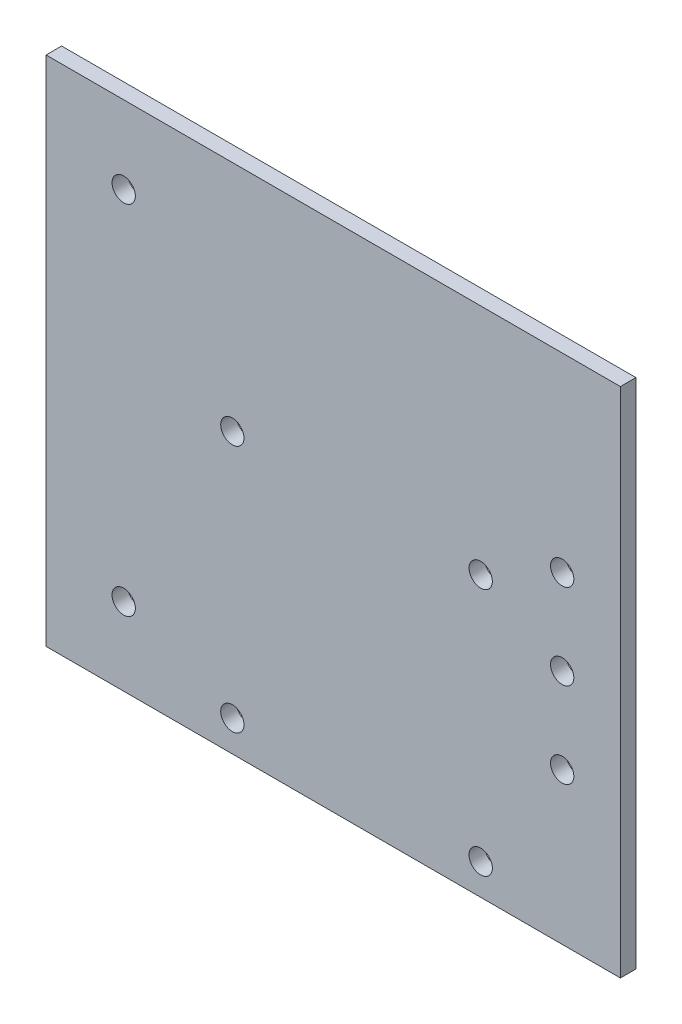
ISO-10303-21;
HEADER;
FILE_DESCRIPTION(('STEP AP214'),'2;1');
FILE_NAME('part.step','',(''),(''),'','','');
FILE_SCHEMA(('AUTOMOTIVE_DESIGN { 1 0 10303 214 1 1 1 1 }'));
ENDSEC;
DATA;
#1=APPLICATION_CONTEXT('core data for automotive mechanical design processes');
#2=APPLICATION_PROTOCOL_DEFINITION('international standard','automotive_design',2000,#1);
#3=PRODUCT_CONTEXT('',#1,'mechanical');
#4=PRODUCT('Part','Part','',(#3));
#5=PRODUCT_RELATED_PRODUCT_CATEGORY('part','',(#4));
#6=PRODUCT_DEFINITION_FORMATION('','',#4);
#7=PRODUCT_DEFINITION_CONTEXT('part definition',#1,'design');
#8=PRODUCT_DEFINITION('design','',#6,#7);
#9=PRODUCT_DEFINITION_SHAPE('','',#8);
#10=(LENGTH_UNIT() NAMED_UNIT(*) SI_UNIT(.MILLI.,.METRE.));
#11=(NAMED_UNIT(*) PLANE_ANGLE_UNIT() SI_UNIT($,.RADIAN.));
#12=(NAMED_UNIT(*) SI_UNIT($,.STERADIAN.) SOLID_ANGLE_UNIT());
#13=UNCERTAINTY_MEASURE_WITH_UNIT(LENGTH_MEASURE(1.E-05),#10,'distance_accuracy_value','');
#14=(GEOMETRIC_REPRESENTATION_CONTEXT(3) GLOBAL_UNCERTAINTY_ASSIGNED_CONTEXT((#13)) GLOBAL_UNIT_ASSIGNED_CONTEXT((#10,
#11,#12)) REPRESENTATION_CONTEXT('',''));
#15=CARTESIAN_POINT('',(0.,0.,0.));
#16=DIRECTION('',(0.,0.,1.));
#17=DIRECTION('',(1.,0.,0.));
#18=AXIS2_PLACEMENT_3D('',#15,#16,#17);
#19=CARTESIAN_POINT('',(-28.1681142061869,-46.7068085106383,2.));
#20=DIRECTION('',(0.,0.,1.));
#21=DIRECTION('',(1.,0.,0.));
#22=AXIS2_PLACEMENT_3D('',#19,#20,#21);
#23=PLANE('',#22);
#24=CARTESIAN_POINT('',(27.8318857938131,-42.7068085106383,2.));
#25=DIRECTION('',(0.,0.,1.));
#26=DIRECTION('',(1.,0.,0.));
#27=AXIS2_PLACEMENT_3D('',#24,#25,#26);
#28=CIRCLE('',#27,1.5);
#29=CARTESIAN_POINT('',(29.3318857938132,-42.7068085106383,2.));
#30=VERTEX_POINT('',#29);
#31=EDGE_CURVE('E126',#30,#30,#28,.T.);
#32=ORIENTED_EDGE('',*,*,#31,.F.);
#33=EDGE_LOOP('',(#32));
#34=FACE_BOUND('',#33,.T.);
#35=CARTESIAN_POINT('',(-4.16811420618686,-42.7068085106383,2.));
#36=DIRECTION('',(0.,0.,1.));
#37=DIRECTION('',(1.,0.,0.));
#38=AXIS2_PLACEMENT_3D('',#35,#36,#37);
#39=CIRCLE('',#38,1.5);
#40=CARTESIAN_POINT('',(-2.66811420618686,-42.7068085106383,2.));
#41=VERTEX_POINT('',#40);
#42=EDGE_CURVE('E116',#41,#41,#39,.T.);
#43=ORIENTED_EDGE('',*,*,#42,.F.);
#44=EDGE_LOOP('',(#43));
#45=FACE_BOUND('',#44,.T.);
#46=CARTESIAN_POINT('',(-4.16811420618686,-10.7068085106383,2.));
#47=DIRECTION('',(0.,0.,1.));
#48=DIRECTION('',(1.,0.,0.));
#49=AXIS2_PLACEMENT_3D('',#46,#47,#48);
#50=CIRCLE('',#49,1.5);
#51=CARTESIAN_POINT('',(-2.66811420618686,-10.7068085106383,2.));
#52=VERTEX_POINT('',#51);
#53=EDGE_CURVE('E113',#52,#52,#50,.T.);
#54=ORIENTED_EDGE('',*,*,#53,.F.);
#55=EDGE_LOOP('',(#54));
#56=FACE_BOUND('',#55,.T.);
#57=CARTESIAN_POINT('',(27.8318857938131,-10.7068085106383,2.));
#58=DIRECTION('',(0.,0.,1.));
#59=DIRECTION('',(1.,0.,0.));
#60=AXIS2_PLACEMENT_3D('',#57,#58,#59);
#61=CIRCLE('',#60,1.5);
#62=CARTESIAN_POINT('',(29.3318857938131,-10.7068085106383,2.));
#63=VERTEX_POINT('',#62);
#64=EDGE_CURVE('E110',#63,#63,#61,.T.);
#65=ORIENTED_EDGE('',*,*,#64,.F.);
#66=EDGE_LOOP('',(#65));
#67=FACE_BOUND('',#66,.T.);
#68=CARTESIAN_POINT('',(38.3318857938131,-27.2068085106383,2.));
#69=DIRECTION('',(0.,0.,1.));
#70=DIRECTION('',(1.,0.,0.));
#71=AXIS2_PLACEMENT_3D('',#68,#69,#70);
#72=CIRCLE('',#71,1.5);
#73=CARTESIAN_POINT('',(39.8318857938131,-27.2068085106383,2.));
#74=VERTEX_POINT('',#73);
#75=EDGE_CURVE('E137',#74,#74,#72,.T.);
#76=ORIENTED_EDGE('',*,*,#75,.F.);
#77=EDGE_LOOP('',(#76));
#78=FACE_BOUND('',#77,.T.);
#79=CARTESIAN_POINT('',(-18.1681142061869,-36.7068085106383,2.));
#80=DIRECTION('',(0.,0.,1.));
#81=DIRECTION('',(1.,0.,0.));
#82=AXIS2_PLACEMENT_3D('',#79,#80,#81);
#83=CIRCLE('',#82,1.5);
#84=CARTESIAN_POINT('',(-16.6681142061869,-36.7068085106383,2.));
#85=VERTEX_POINT('',#84);
#86=EDGE_CURVE('E149',#85,#85,#83,.T.);
#87=ORIENTED_EDGE('',*,*,#86,.F.);
#88=EDGE_LOOP('',(#87));
#89=FACE_BOUND('',#88,.T.);
#90=DIRECTION('',(0.,-1.,0.));
#91=VECTOR('',#90,1.);
#92=CARTESIAN_POINT('',(-28.1681142061869,19.2931914893617,2.));
#93=LINE('',#92,#91);
#94=CARTESIAN_POINT('',(-28.1681142061869,19.2931914893617,2.));
#95=VERTEX_POINT('',#94);
#96=CARTESIAN_POINT('',(-28.1681142061869,-46.7068085106383,2.));
#97=VERTEX_POINT('',#96);
#98=EDGE_CURVE('E84',#95,#97,#93,.T.);
#99=ORIENTED_EDGE('',*,*,#98,.T.);
#100=DIRECTION('',(1.,0.,0.));
#101=VECTOR('',#100,1.);
#102=CARTESIAN_POINT('',(-28.1681142061869,-46.7068085106383,2.));
#103=LINE('',#102,#101);
#104=CARTESIAN_POINT('',(45.8318857938131,-46.7068085106383,2.));
#105=VERTEX_POINT('',#104);
#106=EDGE_CURVE('E79',#97,#105,#103,.T.);
#107=ORIENTED_EDGE('',*,*,#106,.T.);
#108=DIRECTION('',(0.,1.,0.));
#109=VECTOR('',#108,1.);
#110=CARTESIAN_POINT('',(45.8318857938131,19.2931914893617,2.));
#111=LINE('',#110,#109);
#112=CARTESIAN_POINT('',(45.8318857938131,19.2931914893617,2.));
#113=VERTEX_POINT('',#112);
#114=EDGE_CURVE('E82',#105,#113,#111,.T.);
#115=ORIENTED_EDGE('',*,*,#114,.T.);
#116=DIRECTION('',(-1.,0.,0.));
#117=VECTOR('',#116,1.);
#118=CARTESIAN_POINT('',(-28.1681142061869,19.2931914893617,2.));
#119=LINE('',#118,#117);
#120=EDGE_CURVE('E49',#113,#95,#119,.T.);
#121=ORIENTED_EDGE('',*,*,#120,.T.);
#122=EDGE_LOOP('',(#99,#107,#115,#121));
#123=FACE_BOUND('',#122,.T.);
#124=CARTESIAN_POINT('',(-18.1681142061869,9.29319148936171,2.));
#125=DIRECTION('',(0.,0.,1.));
#126=DIRECTION('',(1.,0.,0.));
#127=AXIS2_PLACEMENT_3D('',#124,#125,#126);
#128=CIRCLE('',#127,1.5);
#129=CARTESIAN_POINT('',(-16.6681142061869,9.29319148936171,2.));
#130=VERTEX_POINT('',#129);
#131=EDGE_CURVE('E100',#130,#130,#128,.T.);
#132=ORIENTED_EDGE('',*,*,#131,.F.);
#133=EDGE_LOOP('',(#132));
#134=FACE_BOUND('',#133,.T.);
#135=CARTESIAN_POINT('',(38.3318857938131,-5.2068085106383,2.));
#136=DIRECTION('',(0.,0.,1.));
#137=DIRECTION('',(1.,0.,0.));
#138=AXIS2_PLACEMENT_3D('',#135,#136,#137);
#139=CIRCLE('',#138,1.5);
#140=CARTESIAN_POINT('',(39.8318857938131,-5.2068085106383,2.));
#141=VERTEX_POINT('',#140);
#142=EDGE_CURVE('E143',#141,#141,#139,.T.);
#143=ORIENTED_EDGE('',*,*,#142,.F.);
#144=EDGE_LOOP('',(#143));
#145=FACE_BOUND('',#144,.T.);
#146=CARTESIAN_POINT('',(38.3318857938131,-16.2068085106383,2.));
#147=DIRECTION('',(0.,0.,1.));
#148=DIRECTION('',(1.,0.,0.));
#149=AXIS2_PLACEMENT_3D('',#146,#147,#148);
#150=CIRCLE('',#149,1.5);
#151=CARTESIAN_POINT('',(39.8318857938131,-16.2068085106383,2.));
#152=VERTEX_POINT('',#151);
#153=EDGE_CURVE('E131',#152,#152,#150,.T.);
#154=ORIENTED_EDGE('',*,*,#153,.F.);
#155=EDGE_LOOP('',(#154));
#156=FACE_BOUND('',#155,.T.);
#157=ADVANCED_FACE('F30',(#34,#45,#56,#67,#78,#89,#123,#134,#145,#156),#23,.T.);
#158=CARTESIAN_POINT('',(-28.1681142061869,-46.7068085106383,0.));
#159=DIRECTION('',(0.,0.,1.));
#160=DIRECTION('',(1.,0.,0.));
#161=AXIS2_PLACEMENT_3D('',#158,#159,#160);
#162=PLANE('',#161);
#163=CARTESIAN_POINT('',(27.8318857938131,-42.7068085106383,0.));
#164=DIRECTION('',(0.,0.,1.));
#165=DIRECTION('',(1.,0.,0.));
#166=AXIS2_PLACEMENT_3D('',#163,#164,#165);
#167=CIRCLE('',#166,1.5);
#168=CARTESIAN_POINT('',(29.3318857938132,-42.7068085106383,0.));
#169=VERTEX_POINT('',#168);
#170=EDGE_CURVE('E34',#169,#169,#167,.T.);
#171=ORIENTED_EDGE('',*,*,#170,.T.);
#172=EDGE_LOOP('',(#171));
#173=FACE_BOUND('',#172,.T.);
#174=CARTESIAN_POINT('',(-4.16811420618686,-42.7068085106383,0.));
#175=DIRECTION('',(0.,0.,1.));
#176=DIRECTION('',(1.,0.,0.));
#177=AXIS2_PLACEMENT_3D('',#174,#175,#176);
#178=CIRCLE('',#177,1.5);
#179=CARTESIAN_POINT('',(-2.66811420618686,-42.7068085106383,0.));
#180=VERTEX_POINT('',#179);
#181=EDGE_CURVE('E114',#180,#180,#178,.T.);
#182=ORIENTED_EDGE('',*,*,#181,.T.);
#183=EDGE_LOOP('',(#182));
#184=FACE_BOUND('',#183,.T.);
#185=CARTESIAN_POINT('',(-4.16811420618686,-10.7068085106383,0.));
#186=DIRECTION('',(0.,0.,1.));
#187=DIRECTION('',(1.,0.,0.));
#188=AXIS2_PLACEMENT_3D('',#185,#186,#187);
#189=CIRCLE('',#188,1.5);
#190=CARTESIAN_POINT('',(-2.66811420618686,-10.7068085106383,0.));
#191=VERTEX_POINT('',#190);
#192=EDGE_CURVE('E111',#191,#191,#189,.T.);
#193=ORIENTED_EDGE('',*,*,#192,.T.);
#194=EDGE_LOOP('',(#193));
#195=FACE_BOUND('',#194,.T.);
#196=CARTESIAN_POINT('',(27.8318857938131,-10.7068085106383,0.));
#197=DIRECTION('',(0.,0.,1.));
#198=DIRECTION('',(1.,0.,0.));
#199=AXIS2_PLACEMENT_3D('',#196,#197,#198);
#200=CIRCLE('',#199,1.5);
#201=CARTESIAN_POINT('',(29.3318857938131,-10.7068085106383,0.));
#202=VERTEX_POINT('',#201);
#203=EDGE_CURVE('E106',#202,#202,#200,.T.);
#204=ORIENTED_EDGE('',*,*,#203,.T.);
#205=EDGE_LOOP('',(#204));
#206=FACE_BOUND('',#205,.T.);
#207=CARTESIAN_POINT('',(38.3318857938131,-27.2068085106383,0.));
#208=DIRECTION('',(0.,0.,1.));
#209=DIRECTION('',(1.,0.,0.));
#210=AXIS2_PLACEMENT_3D('',#207,#208,#209);
#211=CIRCLE('',#210,1.5);
#212=CARTESIAN_POINT('',(39.8318857938131,-27.2068085106383,0.));
#213=VERTEX_POINT('',#212);
#214=EDGE_CURVE('E134',#213,#213,#211,.T.);
#215=ORIENTED_EDGE('',*,*,#214,.T.);
#216=EDGE_LOOP('',(#215));
#217=FACE_BOUND('',#216,.T.);
#218=CARTESIAN_POINT('',(-18.1681142061869,-36.7068085106383,0.));
#219=DIRECTION('',(0.,0.,1.));
#220=DIRECTION('',(1.,0.,0.));
#221=AXIS2_PLACEMENT_3D('',#218,#219,#220);
#222=CIRCLE('',#221,1.5);
#223=CARTESIAN_POINT('',(-16.6681142061869,-36.7068085106383,0.));
#224=VERTEX_POINT('',#223);
#225=EDGE_CURVE('E146',#224,#224,#222,.T.);
#226=ORIENTED_EDGE('',*,*,#225,.T.);
#227=EDGE_LOOP('',(#226));
#228=FACE_BOUND('',#227,.T.);
#229=DIRECTION('',(0.,-1.,0.));
#230=VECTOR('',#229,1.);
#231=CARTESIAN_POINT('',(-28.1681142061869,19.2931914893617,0.));
#232=LINE('',#231,#230);
#233=CARTESIAN_POINT('',(-28.1681142061869,19.2931914893617,0.));
#234=VERTEX_POINT('',#233);
#235=CARTESIAN_POINT('',(-28.1681142061869,-46.7068085106383,0.));
#236=VERTEX_POINT('',#235);
#237=EDGE_CURVE('E97',#234,#236,#232,.T.);
#238=ORIENTED_EDGE('',*,*,#237,.F.);
#239=DIRECTION('',(-1.,0.,0.));
#240=VECTOR('',#239,1.);
#241=CARTESIAN_POINT('',(-28.1681142061869,19.2931914893617,0.));
#242=LINE('',#241,#240);
#243=CARTESIAN_POINT('',(45.8318857938131,19.2931914893617,0.));
#244=VERTEX_POINT('',#243);
#245=EDGE_CURVE('E72',#244,#234,#242,.T.);
#246=ORIENTED_EDGE('',*,*,#245,.F.);
#247=DIRECTION('',(0.,1.,0.));
#248=VECTOR('',#247,1.);
#249=CARTESIAN_POINT('',(45.8318857938131,19.2931914893617,0.));
#250=LINE('',#249,#248);
#251=CARTESIAN_POINT('',(45.8318857938131,-46.7068085106383,0.));
#252=VERTEX_POINT('',#251);
#253=EDGE_CURVE('E66',#252,#244,#250,.T.);
#254=ORIENTED_EDGE('',*,*,#253,.F.);
#255=DIRECTION('',(1.,0.,0.));
#256=VECTOR('',#255,1.);
#257=CARTESIAN_POINT('',(-28.1681142061869,-46.7068085106383,0.));
#258=LINE('',#257,#256);
#259=EDGE_CURVE('E88',#236,#252,#258,.T.);
#260=ORIENTED_EDGE('',*,*,#259,.F.);
#261=EDGE_LOOP('',(#238,#246,#254,#260));
#262=FACE_BOUND('',#261,.T.);
#263=CARTESIAN_POINT('',(-18.1681142061869,9.29319148936171,0.));
#264=DIRECTION('',(0.,0.,1.));
#265=DIRECTION('',(1.,0.,0.));
#266=AXIS2_PLACEMENT_3D('',#263,#264,#265);
#267=CIRCLE('',#266,1.5);
#268=CARTESIAN_POINT('',(-16.6681142061869,9.29319148936171,0.));
#269=VERTEX_POINT('',#268);
#270=EDGE_CURVE('E152',#269,#269,#267,.T.);
#271=ORIENTED_EDGE('',*,*,#270,.T.);
#272=EDGE_LOOP('',(#271));
#273=FACE_BOUND('',#272,.T.);
#274=CARTESIAN_POINT('',(38.3318857938131,-5.2068085106383,0.));
#275=DIRECTION('',(0.,0.,1.));
#276=DIRECTION('',(1.,0.,0.));
#277=AXIS2_PLACEMENT_3D('',#274,#275,#276);
#278=CIRCLE('',#277,1.5);
#279=CARTESIAN_POINT('',(39.8318857938131,-5.2068085106383,0.));
#280=VERTEX_POINT('',#279);
#281=EDGE_CURVE('E140',#280,#280,#278,.T.);
#282=ORIENTED_EDGE('',*,*,#281,.T.);
#283=EDGE_LOOP('',(#282));
#284=FACE_BOUND('',#283,.T.);
#285=CARTESIAN_POINT('',(38.3318857938131,-16.2068085106383,0.));
#286=DIRECTION('',(0.,0.,1.));
#287=DIRECTION('',(1.,0.,0.));
#288=AXIS2_PLACEMENT_3D('',#285,#286,#287);
#289=CIRCLE('',#288,1.5);
#290=CARTESIAN_POINT('',(39.8318857938131,-16.2068085106383,0.));
#291=VERTEX_POINT('',#290);
#292=EDGE_CURVE('E109',#291,#291,#289,.T.);
#293=ORIENTED_EDGE('',*,*,#292,.T.);
#294=EDGE_LOOP('',(#293));
#295=FACE_BOUND('',#294,.T.);
#296=ADVANCED_FACE('F160',(#173,#184,#195,#206,#217,#228,#262,#273,#284,#295),#162,.F.);
#297=CARTESIAN_POINT('',(-28.1681142061869,19.2931914893617,2.));
#298=DIRECTION('',(1.,0.,0.));
#299=DIRECTION('',(0.,1.,0.));
#300=AXIS2_PLACEMENT_3D('',#297,#298,#299);
#301=PLANE('',#300);
#302=ORIENTED_EDGE('',*,*,#237,.T.);
#303=DIRECTION('',(0.,0.,-1.));
#304=VECTOR('',#303,1.);
#305=CARTESIAN_POINT('',(-28.1681142061869,-46.7068085106383,2.));
#306=LINE('',#305,#304);
#307=EDGE_CURVE('E11',#97,#236,#306,.T.);
#308=ORIENTED_EDGE('',*,*,#307,.F.);
#309=ORIENTED_EDGE('',*,*,#98,.F.);
#310=DIRECTION('',(0.,0.,-1.));
#311=VECTOR('',#310,1.);
#312=CARTESIAN_POINT('',(-28.1681142061869,19.2931914893617,2.));
#313=LINE('',#312,#311);
#314=EDGE_CURVE('E93',#95,#234,#313,.T.);
#315=ORIENTED_EDGE('',*,*,#314,.T.);
#316=EDGE_LOOP('',(#302,#308,#309,#315));
#317=FACE_BOUND('',#316,.T.);
#318=ADVANCED_FACE('F32',(#317),#301,.F.);
#319=CARTESIAN_POINT('',(-28.1681142061869,-46.7068085106383,2.));
#320=DIRECTION('',(0.,1.,0.));
#321=DIRECTION('',(0.,0.,1.));
#322=AXIS2_PLACEMENT_3D('',#319,#320,#321);
#323=PLANE('',#322);
#324=ORIENTED_EDGE('',*,*,#259,.T.);
#325=DIRECTION('',(0.,0.,-1.));
#326=VECTOR('',#325,1.);
#327=CARTESIAN_POINT('',(45.8318857938131,-46.7068085106383,2.));
#328=LINE('',#327,#326);
#329=EDGE_CURVE('E40',#105,#252,#328,.T.);
#330=ORIENTED_EDGE('',*,*,#329,.F.);
#331=ORIENTED_EDGE('',*,*,#106,.F.);
#332=ORIENTED_EDGE('',*,*,#307,.T.);
#333=EDGE_LOOP('',(#324,#330,#331,#332));
#334=FACE_BOUND('',#333,.T.);
#335=ADVANCED_FACE('F87',(#334),#323,.F.);
#336=CARTESIAN_POINT('',(45.8318857938131,19.2931914893617,2.));
#337=DIRECTION('',(-1.,0.,0.));
#338=DIRECTION('',(0.,-1.,0.));
#339=AXIS2_PLACEMENT_3D('',#336,#337,#338);
#340=PLANE('',#339);
#341=ORIENTED_EDGE('',*,*,#253,.T.);
#342=DIRECTION('',(0.,0.,-1.));
#343=VECTOR('',#342,1.);
#344=CARTESIAN_POINT('',(45.8318857938131,19.2931914893617,2.));
#345=LINE('',#344,#343);
#346=EDGE_CURVE('E89',#113,#244,#345,.T.);
#347=ORIENTED_EDGE('',*,*,#346,.F.);
#348=ORIENTED_EDGE('',*,*,#114,.F.);
#349=ORIENTED_EDGE('',*,*,#329,.T.);
#350=EDGE_LOOP('',(#341,#347,#348,#349));
#351=FACE_BOUND('',#350,.T.);
#352=ADVANCED_FACE('F91',(#351),#340,.F.);
#353=CARTESIAN_POINT('',(-28.1681142061869,19.2931914893617,2.));
#354=DIRECTION('',(0.,-1.,0.));
#355=DIRECTION('',(0.,0.,-1.));
#356=AXIS2_PLACEMENT_3D('',#353,#354,#355);
#357=PLANE('',#356);
#358=ORIENTED_EDGE('',*,*,#245,.T.);
#359=ORIENTED_EDGE('',*,*,#314,.F.);
#360=ORIENTED_EDGE('',*,*,#120,.F.);
#361=ORIENTED_EDGE('',*,*,#346,.T.);
#362=EDGE_LOOP('',(#358,#359,#360,#361));
#363=FACE_BOUND('',#362,.T.);
#364=ADVANCED_FACE('F166',(#363),#357,.F.);
#365=CARTESIAN_POINT('',(-18.1681142061869,9.29319148936171,2.));
#366=DIRECTION('',(0.,0.,-1.));
#367=DIRECTION('',(-1.,0.,0.));
#368=AXIS2_PLACEMENT_3D('',#365,#366,#367);
#369=CYLINDRICAL_SURFACE('',#368,1.5);
#370=ORIENTED_EDGE('',*,*,#131,.T.);
#371=EDGE_LOOP('',(#370));
#372=FACE_BOUND('',#371,.T.);
#373=ORIENTED_EDGE('',*,*,#270,.F.);
#374=EDGE_LOOP('',(#373));
#375=FACE_BOUND('',#374,.T.);
#376=ADVANCED_FACE('F163',(#372,#375),#369,.F.);
#377=CARTESIAN_POINT('',(-18.1681142061869,-36.7068085106383,2.));
#378=DIRECTION('',(0.,0.,-1.));
#379=DIRECTION('',(-1.,0.,0.));
#380=AXIS2_PLACEMENT_3D('',#377,#378,#379);
#381=CYLINDRICAL_SURFACE('',#380,1.5);
#382=ORIENTED_EDGE('',*,*,#86,.T.);
#383=EDGE_LOOP('',(#382));
#384=FACE_BOUND('',#383,.T.);
#385=ORIENTED_EDGE('',*,*,#225,.F.);
#386=EDGE_LOOP('',(#385));
#387=FACE_BOUND('',#386,.T.);
#388=ADVANCED_FACE('F165',(#384,#387),#381,.F.);
#389=CARTESIAN_POINT('',(38.3318857938131,-5.2068085106383,2.));
#390=DIRECTION('',(0.,0.,-1.));
#391=DIRECTION('',(-1.,0.,0.));
#392=AXIS2_PLACEMENT_3D('',#389,#390,#391);
#393=CYLINDRICAL_SURFACE('',#392,1.5);
#394=ORIENTED_EDGE('',*,*,#142,.T.);
#395=EDGE_LOOP('',(#394));
#396=FACE_BOUND('',#395,.T.);
#397=ORIENTED_EDGE('',*,*,#281,.F.);
#398=EDGE_LOOP('',(#397));
#399=FACE_BOUND('',#398,.T.);
#400=ADVANCED_FACE('F173',(#396,#399),#393,.F.);
#401=CARTESIAN_POINT('',(38.3318857938131,-27.2068085106383,2.));
#402=DIRECTION('',(0.,0.,-1.));
#403=DIRECTION('',(-1.,0.,0.));
#404=AXIS2_PLACEMENT_3D('',#401,#402,#403);
#405=CYLINDRICAL_SURFACE('',#404,1.5);
#406=ORIENTED_EDGE('',*,*,#75,.T.);
#407=EDGE_LOOP('',(#406));
#408=FACE_BOUND('',#407,.T.);
#409=ORIENTED_EDGE('',*,*,#214,.F.);
#410=EDGE_LOOP('',(#409));
#411=FACE_BOUND('',#410,.T.);
#412=ADVANCED_FACE('F255',(#408,#411),#405,.F.);
#413=CARTESIAN_POINT('',(38.3318857938131,-16.2068085106383,2.));
#414=DIRECTION('',(0.,0.,-1.));
#415=DIRECTION('',(-1.,0.,0.));
#416=AXIS2_PLACEMENT_3D('',#413,#414,#415);
#417=CYLINDRICAL_SURFACE('',#416,1.5);
#418=ORIENTED_EDGE('',*,*,#153,.T.);
#419=EDGE_LOOP('',(#418));
#420=FACE_BOUND('',#419,.T.);
#421=ORIENTED_EDGE('',*,*,#292,.F.);
#422=EDGE_LOOP('',(#421));
#423=FACE_BOUND('',#422,.T.);
#424=ADVANCED_FACE('F216',(#420,#423),#417,.F.);
#425=CARTESIAN_POINT('',(27.8318857938131,-10.7068085106383,-8.));
#426=DIRECTION('',(0.,0.,1.));
#427=DIRECTION('',(1.,0.,0.));
#428=AXIS2_PLACEMENT_3D('',#425,#426,#427);
#429=CYLINDRICAL_SURFACE('',#428,1.5);
#430=ORIENTED_EDGE('',*,*,#64,.T.);
#431=EDGE_LOOP('',(#430));
#432=FACE_BOUND('',#431,.T.);
#433=ORIENTED_EDGE('',*,*,#203,.F.);
#434=EDGE_LOOP('',(#433));
#435=FACE_BOUND('',#434,.T.);
#436=ADVANCED_FACE('F210',(#432,#435),#429,.F.);
#437=CARTESIAN_POINT('',(-4.16811420618686,-10.7068085106383,-8.));
#438=DIRECTION('',(0.,0.,1.));
#439=DIRECTION('',(1.,0.,0.));
#440=AXIS2_PLACEMENT_3D('',#437,#438,#439);
#441=CYLINDRICAL_SURFACE('',#440,1.5);
#442=ORIENTED_EDGE('',*,*,#53,.T.);
#443=EDGE_LOOP('',(#442));
#444=FACE_BOUND('',#443,.T.);
#445=ORIENTED_EDGE('',*,*,#192,.F.);
#446=EDGE_LOOP('',(#445));
#447=FACE_BOUND('',#446,.T.);
#448=ADVANCED_FACE('F215',(#444,#447),#441,.F.);
#449=CARTESIAN_POINT('',(-4.16811420618686,-42.7068085106383,-8.));
#450=DIRECTION('',(0.,0.,1.));
#451=DIRECTION('',(1.,0.,0.));
#452=AXIS2_PLACEMENT_3D('',#449,#450,#451);
#453=CYLINDRICAL_SURFACE('',#452,1.5);
#454=ORIENTED_EDGE('',*,*,#42,.T.);
#455=EDGE_LOOP('',(#454));
#456=FACE_BOUND('',#455,.T.);
#457=ORIENTED_EDGE('',*,*,#181,.F.);
#458=EDGE_LOOP('',(#457));
#459=FACE_BOUND('',#458,.T.);
#460=ADVANCED_FACE('F228',(#456,#459),#453,.F.);
#461=CARTESIAN_POINT('',(27.8318857938131,-42.7068085106383,-8.));
#462=DIRECTION('',(0.,0.,1.));
#463=DIRECTION('',(1.,0.,0.));
#464=AXIS2_PLACEMENT_3D('',#461,#462,#463);
#465=CYLINDRICAL_SURFACE('',#464,1.5);
#466=ORIENTED_EDGE('',*,*,#31,.T.);
#467=EDGE_LOOP('',(#466));
#468=FACE_BOUND('',#467,.T.);
#469=ORIENTED_EDGE('',*,*,#170,.F.);
#470=EDGE_LOOP('',(#469));
#471=FACE_BOUND('',#470,.T.);
#472=ADVANCED_FACE('F238',(#468,#471),#465,.F.);
#473=CLOSED_SHELL('',(#157,#296,#318,#335,#352,#364,#376,#388,#400,#412,#424,#436,#448,#460,#472));
#474=MANIFOLD_SOLID_BREP('B2',#473);
#475=ADVANCED_BREP_SHAPE_REPRESENTATION('',(#18,#474),#14);
#476=SHAPE_DEFINITION_REPRESENTATION(#9,#475);
ENDSEC;
END-ISO-10303-21;
